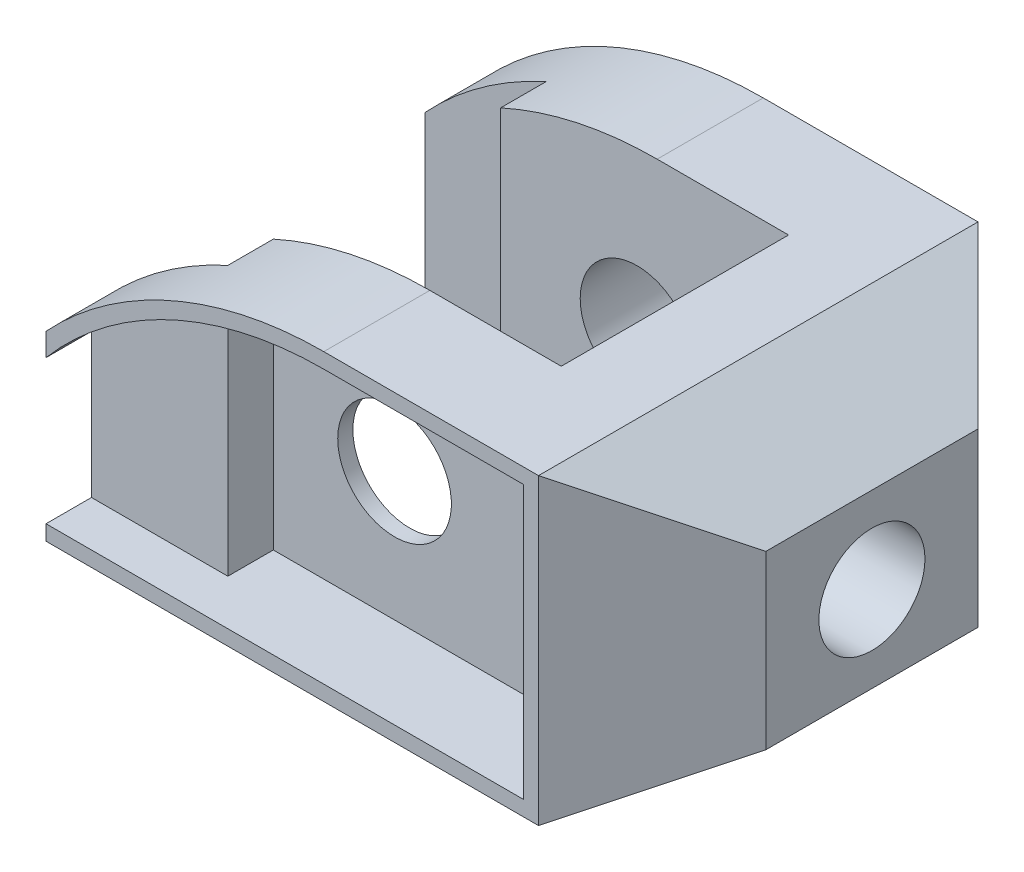
ISO-10303-21;
HEADER;
FILE_DESCRIPTION(('STEP AP214'),'2;1');
FILE_NAME('part.step','',(''),(''),'','','');
FILE_SCHEMA(('AUTOMOTIVE_DESIGN { 1 0 10303 214 1 1 1 1 }'));
ENDSEC;
DATA;
#1=APPLICATION_CONTEXT('core data for automotive mechanical design processes');
#2=APPLICATION_PROTOCOL_DEFINITION('international standard','automotive_design',2000,#1);
#3=PRODUCT_CONTEXT('',#1,'mechanical');
#4=PRODUCT('Part','Part','',(#3));
#5=PRODUCT_RELATED_PRODUCT_CATEGORY('part','',(#4));
#6=PRODUCT_DEFINITION_FORMATION('','',#4);
#7=PRODUCT_DEFINITION_CONTEXT('part definition',#1,'design');
#8=PRODUCT_DEFINITION('design','',#6,#7);
#9=PRODUCT_DEFINITION_SHAPE('','',#8);
#10=(LENGTH_UNIT() NAMED_UNIT(*) SI_UNIT(.MILLI.,.METRE.));
#11=(NAMED_UNIT(*) PLANE_ANGLE_UNIT() SI_UNIT($,.RADIAN.));
#12=(NAMED_UNIT(*) SI_UNIT($,.STERADIAN.) SOLID_ANGLE_UNIT());
#13=UNCERTAINTY_MEASURE_WITH_UNIT(LENGTH_MEASURE(1.E-05),#10,'distance_accuracy_value','');
#14=(GEOMETRIC_REPRESENTATION_CONTEXT(3) GLOBAL_UNCERTAINTY_ASSIGNED_CONTEXT((#13)) GLOBAL_UNIT_ASSIGNED_CONTEXT((#10,
#11,#12)) REPRESENTATION_CONTEXT('',''));
#15=CARTESIAN_POINT('',(0.,0.,0.));
#16=DIRECTION('',(0.,0.,1.));
#17=DIRECTION('',(1.,0.,0.));
#18=AXIS2_PLACEMENT_3D('',#15,#16,#17);
#19=CARTESIAN_POINT('',(65.,0.,58.));
#20=DIRECTION('',(0.,1.,0.));
#21=DIRECTION('',(-1.,0.,0.));
#22=AXIS2_PLACEMENT_3D('',#19,#20,#21);
#23=PLANE('',#22);
#24=DIRECTION('',(-1.,0.,0.));
#25=VECTOR('',#24,1.);
#26=CARTESIAN_POINT('',(16.,0.,8.));
#27=LINE('',#26,#25);
#28=CARTESIAN_POINT('',(16.,0.,8.));
#29=VERTEX_POINT('',#28);
#30=CARTESIAN_POINT('',(0.,0.,8.));
#31=VERTEX_POINT('',#30);
#32=EDGE_CURVE('E266',#29,#31,#27,.T.);
#33=ORIENTED_EDGE('',*,*,#32,.T.);
#34=DIRECTION('',(0.,0.,-1.));
#35=VECTOR('',#34,1.);
#36=CARTESIAN_POINT('',(0.,0.,58.));
#37=LINE('',#36,#35);
#38=CARTESIAN_POINT('',(0.,0.,0.));
#39=VERTEX_POINT('',#38);
#40=EDGE_CURVE('E356',#31,#39,#37,.T.);
#41=ORIENTED_EDGE('',*,*,#40,.T.);
#42=DIRECTION('',(1.,0.,0.));
#43=VECTOR('',#42,1.);
#44=CARTESIAN_POINT('',(65.,0.,0.));
#45=LINE('',#44,#43);
#46=CARTESIAN_POINT('',(65.,0.,0.));
#47=VERTEX_POINT('',#46);
#48=EDGE_CURVE('E339',#39,#47,#45,.T.);
#49=ORIENTED_EDGE('',*,*,#48,.T.);
#50=DIRECTION('',(0.,0.,-1.));
#51=VECTOR('',#50,1.);
#52=CARTESIAN_POINT('',(65.,0.,58.));
#53=LINE('',#52,#51);
#54=CARTESIAN_POINT('',(65.,0.,58.));
#55=VERTEX_POINT('',#54);
#56=EDGE_CURVE('E397',#55,#47,#53,.T.);
#57=ORIENTED_EDGE('',*,*,#56,.F.);
#58=DIRECTION('',(1.,0.,0.));
#59=VECTOR('',#58,1.);
#60=CARTESIAN_POINT('',(65.,0.,58.));
#61=LINE('',#60,#59);
#62=CARTESIAN_POINT('',(0.,0.,58.));
#63=VERTEX_POINT('',#62);
#64=EDGE_CURVE('E340',#63,#55,#61,.T.);
#65=ORIENTED_EDGE('',*,*,#64,.F.);
#66=CARTESIAN_POINT('',(0.,0.,50.));
#67=VERTEX_POINT('',#66);
#68=EDGE_CURVE('E371',#63,#67,#37,.T.);
#69=ORIENTED_EDGE('',*,*,#68,.T.);
#70=DIRECTION('',(1.,0.,0.));
#71=VECTOR('',#70,1.);
#72=CARTESIAN_POINT('',(0.,0.,50.));
#73=LINE('',#72,#71);
#74=CARTESIAN_POINT('',(16.,0.,50.));
#75=VERTEX_POINT('',#74);
#76=EDGE_CURVE('E281',#67,#75,#73,.T.);
#77=ORIENTED_EDGE('',*,*,#76,.T.);
#78=DIRECTION('',(0.,0.,-1.));
#79=VECTOR('',#78,1.);
#80=CARTESIAN_POINT('',(16.,0.,50.));
#81=LINE('',#80,#79);
#82=CARTESIAN_POINT('',(16.,0.,44.));
#83=VERTEX_POINT('',#82);
#84=EDGE_CURVE('E285',#75,#83,#81,.T.);
#85=ORIENTED_EDGE('',*,*,#84,.T.);
#86=DIRECTION('',(1.,0.,0.));
#87=VECTOR('',#86,1.);
#88=CARTESIAN_POINT('',(16.,0.,44.));
#89=LINE('',#88,#87);
#90=CARTESIAN_POINT('',(54.,0.,44.));
#91=VERTEX_POINT('',#90);
#92=EDGE_CURVE('E289',#83,#91,#89,.T.);
#93=ORIENTED_EDGE('',*,*,#92,.T.);
#94=DIRECTION('',(0.,0.,-1.));
#95=VECTOR('',#94,1.);
#96=CARTESIAN_POINT('',(54.,0.,44.));
#97=LINE('',#96,#95);
#98=CARTESIAN_POINT('',(54.,0.,14.));
#99=VERTEX_POINT('',#98);
#100=EDGE_CURVE('E293',#91,#99,#97,.T.);
#101=ORIENTED_EDGE('',*,*,#100,.T.);
#102=DIRECTION('',(-1.,0.,0.));
#103=VECTOR('',#102,1.);
#104=CARTESIAN_POINT('',(54.,0.,14.));
#105=LINE('',#104,#103);
#106=CARTESIAN_POINT('',(16.,0.,14.));
#107=VERTEX_POINT('',#106);
#108=EDGE_CURVE('E297',#99,#107,#105,.T.);
#109=ORIENTED_EDGE('',*,*,#108,.T.);
#110=DIRECTION('',(0.,0.,-1.));
#111=VECTOR('',#110,1.);
#112=CARTESIAN_POINT('',(16.,0.,14.));
#113=LINE('',#112,#111);
#114=EDGE_CURVE('E271',#107,#29,#113,.T.);
#115=ORIENTED_EDGE('',*,*,#114,.T.);
#116=EDGE_LOOP('',(#33,#41,#49,#57,#65,#69,#77,#85,#93,#101,#109,#115));
#117=FACE_BOUND('',#116,.T.);
#118=ADVANCED_FACE('F48',(#117),#23,.F.);
#119=CARTESIAN_POINT('',(36.6606055596467,40.,58.));
#120=DIRECTION('',(0.,-1.,0.));
#121=DIRECTION('',(1.,0.,0.));
#122=AXIS2_PLACEMENT_3D('',#119,#120,#121);
#123=PLANE('',#122);
#124=DIRECTION('',(1.,0.,0.));
#125=VECTOR('',#124,1.);
#126=CARTESIAN_POINT('',(16.,40.,44.));
#127=LINE('',#126,#125);
#128=CARTESIAN_POINT('',(36.6606055596467,40.,44.));
#129=VERTEX_POINT('',#128);
#130=CARTESIAN_POINT('',(54.,40.,44.));
#131=VERTEX_POINT('',#130);
#132=EDGE_CURVE('E267',#129,#131,#127,.T.);
#133=ORIENTED_EDGE('',*,*,#132,.F.);
#134=DIRECTION('',(0.,0.,-1.));
#135=VECTOR('',#134,1.);
#136=CARTESIAN_POINT('',(36.6606055596467,40.,58.));
#137=LINE('',#136,#135);
#138=CARTESIAN_POINT('',(36.6606055596467,40.,58.));
#139=VERTEX_POINT('',#138);
#140=EDGE_CURVE('E381',#139,#129,#137,.T.);
#141=ORIENTED_EDGE('',*,*,#140,.F.);
#142=DIRECTION('',(-1.,0.,0.));
#143=VECTOR('',#142,1.);
#144=CARTESIAN_POINT('',(36.6606055596467,40.,58.));
#145=LINE('',#144,#143);
#146=CARTESIAN_POINT('',(65.,40.,58.));
#147=VERTEX_POINT('',#146);
#148=EDGE_CURVE('E344',#147,#139,#145,.T.);
#149=ORIENTED_EDGE('',*,*,#148,.F.);
#150=DIRECTION('',(0.,0.,-1.));
#151=VECTOR('',#150,1.);
#152=CARTESIAN_POINT('',(65.,40.,58.));
#153=LINE('',#152,#151);
#154=CARTESIAN_POINT('',(65.,40.,0.));
#155=VERTEX_POINT('',#154);
#156=EDGE_CURVE('E385',#147,#155,#153,.T.);
#157=ORIENTED_EDGE('',*,*,#156,.T.);
#158=DIRECTION('',(-1.,0.,0.));
#159=VECTOR('',#158,1.);
#160=CARTESIAN_POINT('',(36.6606055596467,40.,0.));
#161=LINE('',#160,#159);
#162=CARTESIAN_POINT('',(36.6606055596467,40.,0.));
#163=VERTEX_POINT('',#162);
#164=EDGE_CURVE('E360',#155,#163,#161,.T.);
#165=ORIENTED_EDGE('',*,*,#164,.T.);
#166=CARTESIAN_POINT('',(36.6606055596467,40.,14.));
#167=VERTEX_POINT('',#166);
#168=EDGE_CURVE('E380',#167,#163,#137,.T.);
#169=ORIENTED_EDGE('',*,*,#168,.F.);
#170=DIRECTION('',(-1.,0.,0.));
#171=VECTOR('',#170,1.);
#172=CARTESIAN_POINT('',(54.,40.,14.));
#173=LINE('',#172,#171);
#174=CARTESIAN_POINT('',(54.,40.,14.));
#175=VERTEX_POINT('',#174);
#176=EDGE_CURVE('E274',#175,#167,#173,.T.);
#177=ORIENTED_EDGE('',*,*,#176,.F.);
#178=DIRECTION('',(0.,0.,-1.));
#179=VECTOR('',#178,1.);
#180=CARTESIAN_POINT('',(54.,40.,44.));
#181=LINE('',#180,#179);
#182=EDGE_CURVE('E270',#131,#175,#181,.T.);
#183=ORIENTED_EDGE('',*,*,#182,.F.);
#184=EDGE_LOOP('',(#133,#141,#149,#157,#165,#169,#177,#183));
#185=FACE_BOUND('',#184,.T.);
#186=ADVANCED_FACE('F448',(#185),#123,.F.);
#187=CARTESIAN_POINT('',(36.6606055596467,-9.99999999999999,58.));
#188=DIRECTION('',(0.,0.,-1.));
#189=DIRECTION('',(-1.,0.,0.));
#190=AXIS2_PLACEMENT_3D('',#187,#188,#189);
#191=CYLINDRICAL_SURFACE('',#190,50.);
#192=CARTESIAN_POINT('',(36.6606055596467,-9.99999999999999,50.));
#193=DIRECTION('',(0.,0.,-1.));
#194=DIRECTION('',(-1.,0.,0.));
#195=AXIS2_PLACEMENT_3D('',#192,#193,#194);
#196=CIRCLE('',#195,50.);
#197=CARTESIAN_POINT('',(0.,24.,50.));
#198=VERTEX_POINT('',#197);
#199=CARTESIAN_POINT('',(16.,35.5317403347236,50.));
#200=VERTEX_POINT('',#199);
#201=EDGE_CURVE('E329',#198,#200,#196,.T.);
#202=ORIENTED_EDGE('',*,*,#201,.F.);
#203=DIRECTION('',(0.,0.,-1.));
#204=VECTOR('',#203,1.);
#205=CARTESIAN_POINT('',(0.,24.,58.));
#206=LINE('',#205,#204);
#207=CARTESIAN_POINT('',(0.,24.,58.));
#208=VERTEX_POINT('',#207);
#209=EDGE_CURVE('E376',#208,#198,#206,.T.);
#210=ORIENTED_EDGE('',*,*,#209,.F.);
#211=CARTESIAN_POINT('',(36.6606055596467,-9.99999999999999,58.));
#212=DIRECTION('',(0.,0.,1.));
#213=DIRECTION('',(-1.,0.,0.));
#214=AXIS2_PLACEMENT_3D('',#211,#212,#213);
#215=CIRCLE('',#214,50.);
#216=EDGE_CURVE('E348',#139,#208,#215,.T.);
#217=ORIENTED_EDGE('',*,*,#216,.F.);
#218=ORIENTED_EDGE('',*,*,#140,.T.);
#219=CARTESIAN_POINT('',(36.6606055596467,-9.99999999999999,44.));
#220=DIRECTION('',(0.,0.,-1.));
#221=DIRECTION('',(-1.,0.,0.));
#222=AXIS2_PLACEMENT_3D('',#219,#220,#221);
#223=CIRCLE('',#222,50.);
#224=CARTESIAN_POINT('',(16.,35.5317403347236,44.));
#225=VERTEX_POINT('',#224);
#226=EDGE_CURVE('E326',#225,#129,#223,.T.);
#227=ORIENTED_EDGE('',*,*,#226,.F.);
#228=DIRECTION('',(0.,0.,-1.));
#229=VECTOR('',#228,1.);
#230=CARTESIAN_POINT('',(16.,35.5317403347236,58.));
#231=LINE('',#230,#229);
#232=EDGE_CURVE('E416',#200,#225,#231,.T.);
#233=ORIENTED_EDGE('',*,*,#232,.F.);
#234=EDGE_LOOP('',(#202,#210,#217,#218,#227,#233));
#235=FACE_BOUND('',#234,.T.);
#236=ADVANCED_FACE('F454',(#235),#191,.T.);
#237=CARTESIAN_POINT('',(36.6606055596467,-9.99999999999999,8.));
#238=DIRECTION('',(0.,0.,1.));
#239=DIRECTION('',(1.,0.,0.));
#240=AXIS2_PLACEMENT_3D('',#237,#238,#239);
#241=CIRCLE('',#240,50.);
#242=CARTESIAN_POINT('',(16.,35.5317403347236,8.));
#243=VERTEX_POINT('',#242);
#244=CARTESIAN_POINT('',(0.,24.,8.));
#245=VERTEX_POINT('',#244);
#246=EDGE_CURVE('E332',#243,#245,#241,.T.);
#247=ORIENTED_EDGE('',*,*,#246,.F.);
#248=DIRECTION('',(0.,0.,-1.));
#249=VECTOR('',#248,1.);
#250=CARTESIAN_POINT('',(16.,35.5317403347236,58.));
#251=LINE('',#250,#249);
#252=CARTESIAN_POINT('',(16.,35.5317403347236,14.));
#253=VERTEX_POINT('',#252);
#254=EDGE_CURVE('E413',#253,#243,#251,.T.);
#255=ORIENTED_EDGE('',*,*,#254,.F.);
#256=CARTESIAN_POINT('',(36.6606055596467,-9.99999999999999,14.));
#257=DIRECTION('',(0.,0.,1.));
#258=DIRECTION('',(1.,0.,0.));
#259=AXIS2_PLACEMENT_3D('',#256,#257,#258);
#260=CIRCLE('',#259,50.);
#261=EDGE_CURVE('E322',#167,#253,#260,.T.);
#262=ORIENTED_EDGE('',*,*,#261,.F.);
#263=ORIENTED_EDGE('',*,*,#168,.T.);
#264=CARTESIAN_POINT('',(36.6606055596467,-9.99999999999999,0.));
#265=DIRECTION('',(0.,0.,1.));
#266=DIRECTION('',(-1.,0.,0.));
#267=AXIS2_PLACEMENT_3D('',#264,#265,#266);
#268=CIRCLE('',#267,50.);
#269=CARTESIAN_POINT('',(0.,24.,0.));
#270=VERTEX_POINT('',#269);
#271=EDGE_CURVE('E364',#163,#270,#268,.T.);
#272=ORIENTED_EDGE('',*,*,#271,.T.);
#273=EDGE_CURVE('E375',#245,#270,#206,.T.);
#274=ORIENTED_EDGE('',*,*,#273,.F.);
#275=EDGE_LOOP('',(#247,#255,#262,#263,#272,#274));
#276=FACE_BOUND('',#275,.T.);
#277=ADVANCED_FACE('F475',(#276),#191,.T.);
#278=CARTESIAN_POINT('',(0.,0.,58.));
#279=DIRECTION('',(1.,0.,0.));
#280=DIRECTION('',(0.,0.,-1.));
#281=AXIS2_PLACEMENT_3D('',#278,#279,#280);
#282=PLANE('',#281);
#283=DIRECTION('',(0.,-1.,0.));
#284=VECTOR('',#283,1.);
#285=CARTESIAN_POINT('',(0.,0.,8.));
#286=LINE('',#285,#284);
#287=EDGE_CURVE('E410',#245,#31,#286,.T.);
#288=ORIENTED_EDGE('',*,*,#287,.F.);
#289=ORIENTED_EDGE('',*,*,#273,.T.);
#290=DIRECTION('',(0.,-1.,0.));
#291=VECTOR('',#290,1.);
#292=CARTESIAN_POINT('',(0.,0.,0.));
#293=LINE('',#292,#291);
#294=EDGE_CURVE('E345',#270,#39,#293,.T.);
#295=ORIENTED_EDGE('',*,*,#294,.T.);
#296=ORIENTED_EDGE('',*,*,#40,.F.);
#297=EDGE_LOOP('',(#288,#289,#295,#296));
#298=FACE_BOUND('',#297,.T.);
#299=ADVANCED_FACE('F538',(#298),#282,.F.);
#300=DIRECTION('',(0.,-1.,0.));
#301=VECTOR('',#300,1.);
#302=CARTESIAN_POINT('',(0.,0.,58.));
#303=LINE('',#302,#301);
#304=CARTESIAN_POINT('',(0.,2.,58.));
#305=VERTEX_POINT('',#304);
#306=EDGE_CURVE('E351',#305,#63,#303,.T.);
#307=ORIENTED_EDGE('',*,*,#306,.F.);
#308=DIRECTION('',(0.,0.,-1.));
#309=VECTOR('',#308,1.);
#310=CARTESIAN_POINT('',(0.,2.,58.));
#311=LINE('',#310,#309);
#312=CARTESIAN_POINT('',(0.,2.,52.));
#313=VERTEX_POINT('',#312);
#314=EDGE_CURVE('E632',#305,#313,#311,.T.);
#315=ORIENTED_EDGE('',*,*,#314,.T.);
#316=DIRECTION('',(0.,1.,0.));
#317=VECTOR('',#316,1.);
#318=CARTESIAN_POINT('',(0.,0.,52.));
#319=LINE('',#318,#317);
#320=CARTESIAN_POINT('',(0.,20.9838667696594,52.));
#321=VERTEX_POINT('',#320);
#322=EDGE_CURVE('E207',#313,#321,#319,.T.);
#323=ORIENTED_EDGE('',*,*,#322,.T.);
#324=DIRECTION('',(0.,0.,1.));
#325=VECTOR('',#324,1.);
#326=CARTESIAN_POINT('',(0.,20.9838667696594,10.6034513424069));
#327=LINE('',#326,#325);
#328=CARTESIAN_POINT('',(0.,20.9838667696593,58.));
#329=VERTEX_POINT('',#328);
#330=EDGE_CURVE('E635',#321,#329,#327,.T.);
#331=ORIENTED_EDGE('',*,*,#330,.T.);
#332=EDGE_CURVE('E352',#208,#329,#303,.T.);
#333=ORIENTED_EDGE('',*,*,#332,.F.);
#334=ORIENTED_EDGE('',*,*,#209,.T.);
#335=DIRECTION('',(0.,1.,0.));
#336=VECTOR('',#335,1.);
#337=CARTESIAN_POINT('',(0.,0.,50.));
#338=LINE('',#337,#336);
#339=EDGE_CURVE('E401',#67,#198,#338,.T.);
#340=ORIENTED_EDGE('',*,*,#339,.F.);
#341=ORIENTED_EDGE('',*,*,#68,.F.);
#342=EDGE_LOOP('',(#307,#315,#323,#331,#333,#334,#340,#341));
#343=FACE_BOUND('',#342,.T.);
#344=ADVANCED_FACE('F491',(#343),#282,.F.);
#345=CARTESIAN_POINT('',(34.,19.,58.));
#346=DIRECTION('',(0.,0.,-1.));
#347=DIRECTION('',(-1.,0.,0.));
#348=AXIS2_PLACEMENT_3D('',#345,#346,#347);
#349=CYLINDRICAL_SURFACE('',#348,7.5);
#350=CARTESIAN_POINT('',(34.,19.,46.));
#351=DIRECTION('',(0.,0.,-1.));
#352=DIRECTION('',(-1.,0.,0.));
#353=AXIS2_PLACEMENT_3D('',#350,#351,#352);
#354=CIRCLE('',#353,7.5);
#355=CARTESIAN_POINT('',(26.5,19.,46.));
#356=VERTEX_POINT('',#355);
#357=EDGE_CURVE('E51',#356,#356,#354,.T.);
#358=CARTESIAN_POINT('',(34.,19.,44.));
#359=DIRECTION('',(0.,0.,-1.));
#360=DIRECTION('',(-1.,0.,0.));
#361=AXIS2_PLACEMENT_3D('',#358,#359,#360);
#362=CIRCLE('',#361,7.5);
#363=CARTESIAN_POINT('',(26.5,19.,44.));
#364=VERTEX_POINT('',#363);
#365=EDGE_CURVE('E325',#364,#364,#362,.T.);
#366=CARTESIAN_POINT('',(26.5,19.,46.));
#367=CARTESIAN_POINT('',(26.5,19.,45.9791666666667));
#368=CARTESIAN_POINT('',(26.5,19.,45.9583333333333));
#369=CARTESIAN_POINT('',(26.5,19.,45.9166666666667));
#370=CARTESIAN_POINT('',(26.5,19.,45.8958333333333));
#371=CARTESIAN_POINT('',(26.5,19.,45.8541666666667));
#372=CARTESIAN_POINT('',(26.5,19.,45.8333333333333));
#373=CARTESIAN_POINT('',(26.5,19.,45.7916666666667));
#374=CARTESIAN_POINT('',(26.5,19.,45.7708333333333));
#375=CARTESIAN_POINT('',(26.5,19.,45.7291666666667));
#376=CARTESIAN_POINT('',(26.5,19.,45.7083333333333));
#377=CARTESIAN_POINT('',(26.5,19.,45.6666666666667));
#378=CARTESIAN_POINT('',(26.5,19.,45.6458333333333));
#379=CARTESIAN_POINT('',(26.5,19.,45.6041666666667));
#380=CARTESIAN_POINT('',(26.5,19.,45.5833333333333));
#381=CARTESIAN_POINT('',(26.5,19.,45.5416666666667));
#382=CARTESIAN_POINT('',(26.5,19.,45.5208333333333));
#383=CARTESIAN_POINT('',(26.5,19.,45.4791666666667));
#384=CARTESIAN_POINT('',(26.5,19.,45.4583333333333));
#385=CARTESIAN_POINT('',(26.5,19.,45.4166666666667));
#386=CARTESIAN_POINT('',(26.5,19.,45.3958333333333));
#387=CARTESIAN_POINT('',(26.5,19.,45.3541666666667));
#388=CARTESIAN_POINT('',(26.5,19.,45.3333333333333));
#389=CARTESIAN_POINT('',(26.5,19.,45.2916666666667));
#390=CARTESIAN_POINT('',(26.5,19.,45.2708333333333));
#391=CARTESIAN_POINT('',(26.5,19.,45.2291666666667));
#392=CARTESIAN_POINT('',(26.5,19.,45.2083333333333));
#393=CARTESIAN_POINT('',(26.5,19.,45.1666666666667));
#394=CARTESIAN_POINT('',(26.5,19.,45.1458333333333));
#395=CARTESIAN_POINT('',(26.5,19.,45.1041666666667));
#396=CARTESIAN_POINT('',(26.5,19.,45.0833333333333));
#397=CARTESIAN_POINT('',(26.5,19.,45.0416666666667));
#398=CARTESIAN_POINT('',(26.5,19.,45.0208333333333));
#399=CARTESIAN_POINT('',(26.5,19.,44.9791666666667));
#400=CARTESIAN_POINT('',(26.5,19.,44.9583333333333));
#401=CARTESIAN_POINT('',(26.5,19.,44.9166666666667));
#402=CARTESIAN_POINT('',(26.5,19.,44.8958333333333));
#403=CARTESIAN_POINT('',(26.5,19.,44.8541666666667));
#404=CARTESIAN_POINT('',(26.5,19.,44.8333333333333));
#405=CARTESIAN_POINT('',(26.5,19.,44.7916666666667));
#406=CARTESIAN_POINT('',(26.5,19.,44.7708333333333));
#407=CARTESIAN_POINT('',(26.5,19.,44.7291666666667));
#408=CARTESIAN_POINT('',(26.5,19.,44.7083333333333));
#409=CARTESIAN_POINT('',(26.5,19.,44.6666666666667));
#410=CARTESIAN_POINT('',(26.5,19.,44.6458333333333));
#411=CARTESIAN_POINT('',(26.5,19.,44.6041666666667));
#412=CARTESIAN_POINT('',(26.5,19.,44.5833333333333));
#413=CARTESIAN_POINT('',(26.5,19.,44.5416666666667));
#414=CARTESIAN_POINT('',(26.5,19.,44.5208333333333));
#415=CARTESIAN_POINT('',(26.5,19.,44.4791666666667));
#416=CARTESIAN_POINT('',(26.5,19.,44.4583333333333));
#417=CARTESIAN_POINT('',(26.5,19.,44.4166666666667));
#418=CARTESIAN_POINT('',(26.5,19.,44.3958333333333));
#419=CARTESIAN_POINT('',(26.5,19.,44.3541666666667));
#420=CARTESIAN_POINT('',(26.5,19.,44.3333333333333));
#421=CARTESIAN_POINT('',(26.5,19.,44.2916666666667));
#422=CARTESIAN_POINT('',(26.5,19.,44.2708333333333));
#423=CARTESIAN_POINT('',(26.5,19.,44.2291666666667));
#424=CARTESIAN_POINT('',(26.5,19.,44.2083333333333));
#425=CARTESIAN_POINT('',(26.5,19.,44.1666666666667));
#426=CARTESIAN_POINT('',(26.5,19.,44.1458333333333));
#427=CARTESIAN_POINT('',(26.5,19.,44.1041666666667));
#428=CARTESIAN_POINT('',(26.5,19.,44.0833333333333));
#429=CARTESIAN_POINT('',(26.5,19.,44.0416666666667));
#430=CARTESIAN_POINT('',(26.5,19.,44.0208333333333));
#431=CARTESIAN_POINT('',(26.5,19.,44.));
#432=B_SPLINE_CURVE_WITH_KNOTS('',3,(#366,#367,#368,#369,#370,#371,#372,#373,#374,#375,#376,
#377,#378,#379,#380,#381,#382,#383,#384,#385,#386,#387,#388,#389,#390,#391,#392,#393,#394,#395,
#396,#397,#398,#399,#400,#401,#402,#403,#404,#405,#406,#407,#408,#409,#410,#411,#412,#413,#414,
#415,#416,#417,#418,#419,#420,#421,#422,#423,#424,#425,#426,#427,#428,#429,#430,#431),
.UNSPECIFIED.,.F.,.F.,(4,2,2,2,2,2,2,2,2,2,2,2,2,2,2,2,2,2,2,2,2,2,2,2,2,2,2,2,2,2,2,2,4),(0.,
0.0625000000000001,0.125,0.1875,0.25,0.3125,0.375,0.4375,0.5,0.5625,0.625000000000001,
0.687500000000001,0.750000000000001,0.812500000000001,0.875000000000001,0.937500000000001,1.,
1.0625,1.125,1.1875,1.25,1.3125,1.375,1.4375,1.5,1.5625,1.625,1.6875,1.75,1.8125,1.875,1.9375,
2.),.UNSPECIFIED.);
#433=EDGE_CURVE('BSEAM546',#356,#364,#432,.T.);
#434=ORIENTED_EDGE('',*,*,#357,.F.);
#435=ORIENTED_EDGE('',*,*,#365,.T.);
#436=ORIENTED_EDGE('',*,*,#433,.T.);
#437=ORIENTED_EDGE('',*,*,#433,.F.);
#438=EDGE_LOOP('',(#434,#436,#435,#437));
#439=FACE_BOUND('',#438,.T.);
#440=ADVANCED_FACE('F546',(#439),#349,.F.);
#441=CARTESIAN_POINT('',(34.,19.,0.));
#442=DIRECTION('',(0.,0.,1.));
#443=DIRECTION('',(1.,0.,0.));
#444=AXIS2_PLACEMENT_3D('',#441,#442,#443);
#445=CIRCLE('',#444,7.5);
#446=CARTESIAN_POINT('',(26.5,19.,0.));
#447=VERTEX_POINT('',#446);
#448=EDGE_CURVE('E335',#447,#447,#445,.T.);
#449=CARTESIAN_POINT('',(34.,19.,14.));
#450=DIRECTION('',(0.,0.,1.));
#451=DIRECTION('',(1.,0.,0.));
#452=AXIS2_PLACEMENT_3D('',#449,#450,#451);
#453=CIRCLE('',#452,7.5);
#454=CARTESIAN_POINT('',(26.5,19.,14.));
#455=VERTEX_POINT('',#454);
#456=EDGE_CURVE('E321',#455,#455,#453,.T.);
#457=CARTESIAN_POINT('',(26.5,19.,0.));
#458=CARTESIAN_POINT('',(26.5,19.,0.145833333333333));
#459=CARTESIAN_POINT('',(26.5,19.,0.291666666666667));
#460=CARTESIAN_POINT('',(26.5,19.,0.583333333333334));
#461=CARTESIAN_POINT('',(26.5,19.,0.729166666666667));
#462=CARTESIAN_POINT('',(26.5,19.,1.02083333333333));
#463=CARTESIAN_POINT('',(26.5,19.,1.16666666666667));
#464=CARTESIAN_POINT('',(26.5,19.,1.45833333333333));
#465=CARTESIAN_POINT('',(26.5,19.,1.60416666666667));
#466=CARTESIAN_POINT('',(26.5,19.,1.89583333333334));
#467=CARTESIAN_POINT('',(26.5,19.,2.04166666666667));
#468=CARTESIAN_POINT('',(26.5,19.,2.33333333333334));
#469=CARTESIAN_POINT('',(26.5,19.,2.47916666666667));
#470=CARTESIAN_POINT('',(26.5,19.,2.77083333333334));
#471=CARTESIAN_POINT('',(26.5,19.,2.91666666666667));
#472=CARTESIAN_POINT('',(26.5,19.,3.20833333333334));
#473=CARTESIAN_POINT('',(26.5,19.,3.35416666666667));
#474=CARTESIAN_POINT('',(26.5,19.,3.64583333333333));
#475=CARTESIAN_POINT('',(26.5,19.,3.79166666666667));
#476=CARTESIAN_POINT('',(26.5,19.,4.08333333333333));
#477=CARTESIAN_POINT('',(26.5,19.,4.22916666666666));
#478=CARTESIAN_POINT('',(26.5,19.,4.52083333333333));
#479=CARTESIAN_POINT('',(26.5,19.,4.66666666666666));
#480=CARTESIAN_POINT('',(26.5,19.,4.95833333333333));
#481=CARTESIAN_POINT('',(26.5,19.,5.10416666666666));
#482=CARTESIAN_POINT('',(26.5,19.,5.39583333333333));
#483=CARTESIAN_POINT('',(26.5,19.,5.54166666666666));
#484=CARTESIAN_POINT('',(26.5,19.,5.83333333333333));
#485=CARTESIAN_POINT('',(26.5,19.,5.97916666666667));
#486=CARTESIAN_POINT('',(26.5,19.,6.27083333333333));
#487=CARTESIAN_POINT('',(26.5,19.,6.41666666666667));
#488=CARTESIAN_POINT('',(26.5,19.,6.70833333333333));
#489=CARTESIAN_POINT('',(26.5,19.,6.85416666666667));
#490=CARTESIAN_POINT('',(26.5,19.,7.14583333333333));
#491=CARTESIAN_POINT('',(26.5,19.,7.29166666666667));
#492=CARTESIAN_POINT('',(26.5,19.,7.58333333333333));
#493=CARTESIAN_POINT('',(26.5,19.,7.72916666666667));
#494=CARTESIAN_POINT('',(26.5,19.,8.02083333333333));
#495=CARTESIAN_POINT('',(26.5,19.,8.16666666666667));
#496=CARTESIAN_POINT('',(26.5,19.,8.45833333333333));
#497=CARTESIAN_POINT('',(26.5,19.,8.60416666666667));
#498=CARTESIAN_POINT('',(26.5,19.,8.89583333333333));
#499=CARTESIAN_POINT('',(26.5,19.,9.04166666666667));
#500=CARTESIAN_POINT('',(26.5,19.,9.33333333333333));
#501=CARTESIAN_POINT('',(26.5,19.,9.47916666666666));
#502=CARTESIAN_POINT('',(26.5,19.,9.77083333333333));
#503=CARTESIAN_POINT('',(26.5,19.,9.91666666666667));
#504=CARTESIAN_POINT('',(26.5,19.,10.2083333333333));
#505=CARTESIAN_POINT('',(26.5,19.,10.3541666666667));
#506=CARTESIAN_POINT('',(26.5,19.,10.6458333333333));
#507=CARTESIAN_POINT('',(26.5,19.,10.7916666666667));
#508=CARTESIAN_POINT('',(26.5,19.,11.0833333333333));
#509=CARTESIAN_POINT('',(26.5,19.,11.2291666666667));
#510=CARTESIAN_POINT('',(26.5,19.,11.5208333333333));
#511=CARTESIAN_POINT('',(26.5,19.,11.6666666666667));
#512=CARTESIAN_POINT('',(26.5,19.,11.9583333333333));
#513=CARTESIAN_POINT('',(26.5,19.,12.1041666666667));
#514=CARTESIAN_POINT('',(26.5,19.,12.3958333333333));
#515=CARTESIAN_POINT('',(26.5,19.,12.5416666666667));
#516=CARTESIAN_POINT('',(26.5,19.,12.8333333333333));
#517=CARTESIAN_POINT('',(26.5,19.,12.9791666666667));
#518=CARTESIAN_POINT('',(26.5,19.,13.2708333333333));
#519=CARTESIAN_POINT('',(26.5,19.,13.4166666666667));
#520=CARTESIAN_POINT('',(26.5,19.,13.7083333333333));
#521=CARTESIAN_POINT('',(26.5,19.,13.8541666666667));
#522=CARTESIAN_POINT('',(26.5,19.,14.));
#523=B_SPLINE_CURVE_WITH_KNOTS('',3,(#457,#458,#459,#460,#461,#462,#463,#464,#465,#466,#467,
#468,#469,#470,#471,#472,#473,#474,#475,#476,#477,#478,#479,#480,#481,#482,#483,#484,#485,#486,
#487,#488,#489,#490,#491,#492,#493,#494,#495,#496,#497,#498,#499,#500,#501,#502,#503,#504,#505,
#506,#507,#508,#509,#510,#511,#512,#513,#514,#515,#516,#517,#518,#519,#520,#521,#522),
.UNSPECIFIED.,.F.,.F.,(4,2,2,2,2,2,2,2,2,2,2,2,2,2,2,2,2,2,2,2,2,2,2,2,2,2,2,2,2,2,2,2,4),(0.,
0.4375,0.875000000000001,1.3125,1.75,2.1875,2.625,3.0625,3.5,3.9375,4.375,4.8125,5.25,5.6875,
6.125,6.5625,7.,7.4375,7.875,8.3125,8.75,9.1875,9.62499999999999,10.0625,10.5,10.9375,11.375,
11.8125,12.25,12.6875,13.125,13.5625,14.),.UNSPECIFIED.);
#524=EDGE_CURVE('BSEAM535',#447,#455,#523,.T.);
#525=ORIENTED_EDGE('',*,*,#448,.F.);
#526=ORIENTED_EDGE('',*,*,#456,.T.);
#527=ORIENTED_EDGE('',*,*,#524,.T.);
#528=ORIENTED_EDGE('',*,*,#524,.F.);
#529=EDGE_LOOP('',(#525,#527,#526,#528));
#530=FACE_BOUND('',#529,.T.);
#531=ADVANCED_FACE('F535',(#530),#349,.F.);
#532=CARTESIAN_POINT('',(36.6606055596467,-9.99999999999999,58.));
#533=DIRECTION('',(0.,0.,-1.));
#534=DIRECTION('',(-1.,0.,0.));
#535=AXIS2_PLACEMENT_3D('',#532,#533,#534);
#536=PLANE('',#535);
#537=DIRECTION('',(1.,0.,0.));
#538=VECTOR('',#537,1.);
#539=CARTESIAN_POINT('',(18.,1.99999999999999,58.));
#540=LINE('',#539,#538);
#541=CARTESIAN_POINT('',(63.,1.99999999999995,58.));
#542=VERTEX_POINT('',#541);
#543=EDGE_CURVE('E488',#305,#542,#540,.T.);
#544=ORIENTED_EDGE('',*,*,#543,.F.);
#545=ORIENTED_EDGE('',*,*,#306,.T.);
#546=ORIENTED_EDGE('',*,*,#64,.T.);
#547=DIRECTION('',(0.,1.,0.));
#548=VECTOR('',#547,1.);
#549=CARTESIAN_POINT('',(65.,0.,58.));
#550=LINE('',#549,#548);
#551=EDGE_CURVE('E253',#55,#147,#550,.T.);
#552=ORIENTED_EDGE('',*,*,#551,.T.);
#553=ORIENTED_EDGE('',*,*,#148,.T.);
#554=ORIENTED_EDGE('',*,*,#216,.T.);
#555=ORIENTED_EDGE('',*,*,#332,.T.);
#556=CARTESIAN_POINT('',(36.6606055596467,-9.99999999999999,58.));
#557=DIRECTION('',(0.,0.,1.));
#558=DIRECTION('',(1.,0.,0.));
#559=AXIS2_PLACEMENT_3D('',#556,#557,#558);
#560=CIRCLE('',#559,48.);
#561=CARTESIAN_POINT('',(36.6606055596467,38.,58.));
#562=VERTEX_POINT('',#561);
#563=EDGE_CURVE('E617',#562,#329,#560,.T.);
#564=ORIENTED_EDGE('',*,*,#563,.F.);
#565=DIRECTION('',(-1.,0.,0.));
#566=VECTOR('',#565,1.);
#567=CARTESIAN_POINT('',(63.,38.,58.));
#568=LINE('',#567,#566);
#569=CARTESIAN_POINT('',(63.,38.,58.));
#570=VERTEX_POINT('',#569);
#571=EDGE_CURVE('E620',#570,#562,#568,.T.);
#572=ORIENTED_EDGE('',*,*,#571,.F.);
#573=DIRECTION('',(0.,1.,0.));
#574=VECTOR('',#573,1.);
#575=CARTESIAN_POINT('',(63.,1.99999999999995,58.));
#576=LINE('',#575,#574);
#577=EDGE_CURVE('E625',#542,#570,#576,.T.);
#578=ORIENTED_EDGE('',*,*,#577,.F.);
#579=EDGE_LOOP('',(#544,#545,#546,#552,#553,#554,#555,#564,#572,#578));
#580=FACE_BOUND('',#579,.T.);
#581=ADVANCED_FACE('F459',(#580),#536,.F.);
#582=CARTESIAN_POINT('',(36.6606055596467,-9.99999999999999,0.));
#583=DIRECTION('',(0.,0.,-1.));
#584=DIRECTION('',(-1.,0.,0.));
#585=AXIS2_PLACEMENT_3D('',#582,#583,#584);
#586=PLANE('',#585);
#587=DIRECTION('',(0.,1.,0.));
#588=VECTOR('',#587,1.);
#589=CARTESIAN_POINT('',(65.,0.,0.));
#590=LINE('',#589,#588);
#591=EDGE_CURVE('E245',#47,#155,#590,.T.);
#592=ORIENTED_EDGE('',*,*,#591,.F.);
#593=ORIENTED_EDGE('',*,*,#48,.F.);
#594=ORIENTED_EDGE('',*,*,#294,.F.);
#595=ORIENTED_EDGE('',*,*,#271,.F.);
#596=ORIENTED_EDGE('',*,*,#164,.F.);
#597=EDGE_LOOP('',(#592,#593,#594,#595,#596));
#598=FACE_BOUND('',#597,.T.);
#599=ORIENTED_EDGE('',*,*,#448,.T.);
#600=EDGE_LOOP('',(#599));
#601=FACE_BOUND('',#600,.T.);
#602=ADVANCED_FACE('F468',(#598,#601),#586,.T.);
#603=CARTESIAN_POINT('',(80.,8.66025403784442,58.));
#604=DIRECTION('',(-0.500000000000002,0.866025403784437,0.));
#605=DIRECTION('',(-0.866025403784437,-0.500000000000002,0.));
#606=AXIS2_PLACEMENT_3D('',#603,#604,#605);
#607=PLANE('',#606);
#608=ORIENTED_EDGE('',*,*,#56,.T.);
#609=DIRECTION('',(0.65465367070798,0.377964473009231,0.654653670707973));
#610=VECTOR('',#609,1.);
#611=CARTESIAN_POINT('',(98.4285714285714,19.2999947129104,33.4285714285711));
#612=LINE('',#611,#610);
#613=CARTESIAN_POINT('',(80.,8.66025403784442,14.9999999999998));
#614=VERTEX_POINT('',#613);
#615=EDGE_CURVE('E262',#47,#614,#612,.T.);
#616=ORIENTED_EDGE('',*,*,#615,.T.);
#617=DIRECTION('',(0.,0.,-1.));
#618=VECTOR('',#617,1.);
#619=CARTESIAN_POINT('',(80.,8.66025403784442,58.));
#620=LINE('',#619,#618);
#621=CARTESIAN_POINT('',(80.,8.66025403784442,43.0000000000002));
#622=VERTEX_POINT('',#621);
#623=EDGE_CURVE('E393',#622,#614,#620,.T.);
#624=ORIENTED_EDGE('',*,*,#623,.F.);
#625=DIRECTION('',(-0.65465367070798,-0.377964473009231,0.654653670707972));
#626=VECTOR('',#625,1.);
#627=CARTESIAN_POINT('',(73.5714285714287,4.948716593054,49.4285714285714));
#628=LINE('',#627,#626);
#629=EDGE_CURVE('E248',#622,#55,#628,.T.);
#630=ORIENTED_EDGE('',*,*,#629,.T.);
#631=EDGE_LOOP('',(#608,#616,#624,#630));
#632=FACE_BOUND('',#631,.T.);
#633=ADVANCED_FACE('F493',(#632),#607,.F.);
#634=CARTESIAN_POINT('',(80.,31.3397459621556,58.));
#635=DIRECTION('',(-1.,0.,0.));
#636=DIRECTION('',(0.,0.,1.));
#637=AXIS2_PLACEMENT_3D('',#634,#635,#636);
#638=PLANE('',#637);
#639=CARTESIAN_POINT('',(80.,20.,29.));
#640=DIRECTION('',(1.,0.,0.));
#641=DIRECTION('',(0.,0.,-1.));
#642=AXIS2_PLACEMENT_3D('',#639,#640,#641);
#643=CIRCLE('',#642,7.);
#644=CARTESIAN_POINT('',(80.,20.,22.));
#645=VERTEX_POINT('',#644);
#646=EDGE_CURVE('E235',#645,#645,#643,.T.);
#647=ORIENTED_EDGE('',*,*,#646,.F.);
#648=EDGE_LOOP('',(#647));
#649=FACE_BOUND('',#648,.T.);
#650=ORIENTED_EDGE('',*,*,#623,.T.);
#651=DIRECTION('',(0.,1.,0.));
#652=VECTOR('',#651,1.);
#653=CARTESIAN_POINT('',(80.,0.,14.9999999999998));
#654=LINE('',#653,#652);
#655=CARTESIAN_POINT('',(80.,31.3397459621556,14.9999999999998));
#656=VERTEX_POINT('',#655);
#657=EDGE_CURVE('E249',#614,#656,#654,.T.);
#658=ORIENTED_EDGE('',*,*,#657,.T.);
#659=DIRECTION('',(0.,0.,-1.));
#660=VECTOR('',#659,1.);
#661=CARTESIAN_POINT('',(80.,31.3397459621556,58.));
#662=LINE('',#661,#660);
#663=CARTESIAN_POINT('',(80.,31.3397459621556,43.0000000000002));
#664=VERTEX_POINT('',#663);
#665=EDGE_CURVE('E389',#664,#656,#662,.T.);
#666=ORIENTED_EDGE('',*,*,#665,.F.);
#667=DIRECTION('',(0.,1.,0.));
#668=VECTOR('',#667,1.);
#669=CARTESIAN_POINT('',(80.,0.,43.0000000000002));
#670=LINE('',#669,#668);
#671=EDGE_CURVE('E73',#622,#664,#670,.T.);
#672=ORIENTED_EDGE('',*,*,#671,.F.);
#673=EDGE_LOOP('',(#650,#658,#666,#672));
#674=FACE_BOUND('',#673,.T.);
#675=ADVANCED_FACE('F497',(#649,#674),#638,.F.);
#676=CARTESIAN_POINT('',(65.,40.,58.));
#677=DIRECTION('',(-0.500000000000001,-0.866025403784438,0.));
#678=DIRECTION('',(0.866025403784438,-0.500000000000001,0.));
#679=AXIS2_PLACEMENT_3D('',#676,#677,#678);
#680=PLANE('',#679);
#681=ORIENTED_EDGE('',*,*,#665,.T.);
#682=DIRECTION('',(-0.65465367070798,0.377964473009229,-0.654653670707973));
#683=VECTOR('',#682,1.);
#684=CARTESIAN_POINT('',(89.8571428571428,25.6487218801436,24.8571428571425));
#685=LINE('',#684,#683);
#686=EDGE_CURVE('E13',#656,#155,#685,.T.);
#687=ORIENTED_EDGE('',*,*,#686,.T.);
#688=ORIENTED_EDGE('',*,*,#156,.F.);
#689=DIRECTION('',(0.65465367070798,-0.377964473009229,-0.654653670707973));
#690=VECTOR('',#689,1.);
#691=CARTESIAN_POINT('',(65.,40.,58.));
#692=LINE('',#691,#690);
#693=EDGE_CURVE('E57',#147,#664,#692,.T.);
#694=ORIENTED_EDGE('',*,*,#693,.T.);
#695=EDGE_LOOP('',(#681,#687,#688,#694));
#696=FACE_BOUND('',#695,.T.);
#697=ADVANCED_FACE('F498',(#696),#680,.F.);
#698=CARTESIAN_POINT('',(16.,40.,50.));
#699=DIRECTION('',(-1.,0.,0.));
#700=DIRECTION('',(0.,0.,1.));
#701=AXIS2_PLACEMENT_3D('',#698,#699,#700);
#702=PLANE('',#701);
#703=ORIENTED_EDGE('',*,*,#232,.T.);
#704=DIRECTION('',(0.,-1.,0.));
#705=VECTOR('',#704,1.);
#706=CARTESIAN_POINT('',(16.,40.,44.));
#707=LINE('',#706,#705);
#708=EDGE_CURVE('E315',#225,#83,#707,.T.);
#709=ORIENTED_EDGE('',*,*,#708,.T.);
#710=ORIENTED_EDGE('',*,*,#84,.F.);
#711=DIRECTION('',(0.,-1.,0.));
#712=VECTOR('',#711,1.);
#713=CARTESIAN_POINT('',(16.,40.,50.));
#714=LINE('',#713,#712);
#715=EDGE_CURVE('E318',#200,#75,#714,.T.);
#716=ORIENTED_EDGE('',*,*,#715,.F.);
#717=EDGE_LOOP('',(#703,#709,#710,#716));
#718=FACE_BOUND('',#717,.T.);
#719=ADVANCED_FACE('F526',(#718),#702,.T.);
#720=CARTESIAN_POINT('',(16.,40.,14.));
#721=DIRECTION('',(-1.,0.,0.));
#722=DIRECTION('',(0.,0.,1.));
#723=AXIS2_PLACEMENT_3D('',#720,#721,#722);
#724=PLANE('',#723);
#725=ORIENTED_EDGE('',*,*,#254,.T.);
#726=DIRECTION('',(0.,-1.,0.));
#727=VECTOR('',#726,1.);
#728=CARTESIAN_POINT('',(16.,40.,8.));
#729=LINE('',#728,#727);
#730=EDGE_CURVE('E277',#243,#29,#729,.T.);
#731=ORIENTED_EDGE('',*,*,#730,.T.);
#732=ORIENTED_EDGE('',*,*,#114,.F.);
#733=DIRECTION('',(0.,-1.,0.));
#734=VECTOR('',#733,1.);
#735=CARTESIAN_POINT('',(16.,40.,14.));
#736=LINE('',#735,#734);
#737=EDGE_CURVE('E306',#253,#107,#736,.T.);
#738=ORIENTED_EDGE('',*,*,#737,.F.);
#739=EDGE_LOOP('',(#725,#731,#732,#738));
#740=FACE_BOUND('',#739,.T.);
#741=ADVANCED_FACE('F556',(#740),#724,.T.);
#742=CARTESIAN_POINT('',(16.,40.,8.));
#743=DIRECTION('',(0.,0.,1.));
#744=DIRECTION('',(1.,0.,0.));
#745=AXIS2_PLACEMENT_3D('',#742,#743,#744);
#746=PLANE('',#745);
#747=ORIENTED_EDGE('',*,*,#246,.T.);
#748=ORIENTED_EDGE('',*,*,#287,.T.);
#749=ORIENTED_EDGE('',*,*,#32,.F.);
#750=ORIENTED_EDGE('',*,*,#730,.F.);
#751=EDGE_LOOP('',(#747,#748,#749,#750));
#752=FACE_BOUND('',#751,.T.);
#753=ADVANCED_FACE('F551',(#752),#746,.T.);
#754=CARTESIAN_POINT('',(0.,40.,50.));
#755=DIRECTION('',(0.,0.,-1.));
#756=DIRECTION('',(-1.,0.,0.));
#757=AXIS2_PLACEMENT_3D('',#754,#755,#756);
#758=PLANE('',#757);
#759=ORIENTED_EDGE('',*,*,#201,.T.);
#760=ORIENTED_EDGE('',*,*,#715,.T.);
#761=ORIENTED_EDGE('',*,*,#76,.F.);
#762=ORIENTED_EDGE('',*,*,#339,.T.);
#763=EDGE_LOOP('',(#759,#760,#761,#762));
#764=FACE_BOUND('',#763,.T.);
#765=ADVANCED_FACE('F563',(#764),#758,.T.);
#766=CARTESIAN_POINT('',(16.,40.,44.));
#767=DIRECTION('',(0.,0.,-1.));
#768=DIRECTION('',(-1.,0.,0.));
#769=AXIS2_PLACEMENT_3D('',#766,#767,#768);
#770=PLANE('',#769);
#771=ORIENTED_EDGE('',*,*,#365,.F.);
#772=EDGE_LOOP('',(#771));
#773=FACE_BOUND('',#772,.T.);
#774=ORIENTED_EDGE('',*,*,#226,.T.);
#775=ORIENTED_EDGE('',*,*,#132,.T.);
#776=DIRECTION('',(0.,-1.,0.));
#777=VECTOR('',#776,1.);
#778=CARTESIAN_POINT('',(54.,40.,44.));
#779=LINE('',#778,#777);
#780=EDGE_CURVE('E312',#131,#91,#779,.T.);
#781=ORIENTED_EDGE('',*,*,#780,.T.);
#782=ORIENTED_EDGE('',*,*,#92,.F.);
#783=ORIENTED_EDGE('',*,*,#708,.F.);
#784=EDGE_LOOP('',(#774,#775,#781,#782,#783));
#785=FACE_BOUND('',#784,.T.);
#786=ADVANCED_FACE('F443',(#773,#785),#770,.T.);
#787=CARTESIAN_POINT('',(54.,40.,14.));
#788=DIRECTION('',(0.,0.,1.));
#789=DIRECTION('',(1.,0.,0.));
#790=AXIS2_PLACEMENT_3D('',#787,#788,#789);
#791=PLANE('',#790);
#792=ORIENTED_EDGE('',*,*,#456,.F.);
#793=EDGE_LOOP('',(#792));
#794=FACE_BOUND('',#793,.T.);
#795=ORIENTED_EDGE('',*,*,#261,.T.);
#796=ORIENTED_EDGE('',*,*,#737,.T.);
#797=ORIENTED_EDGE('',*,*,#108,.F.);
#798=DIRECTION('',(0.,-1.,0.));
#799=VECTOR('',#798,1.);
#800=CARTESIAN_POINT('',(54.,40.,14.));
#801=LINE('',#800,#799);
#802=EDGE_CURVE('E309',#175,#99,#801,.T.);
#803=ORIENTED_EDGE('',*,*,#802,.F.);
#804=ORIENTED_EDGE('',*,*,#176,.T.);
#805=EDGE_LOOP('',(#795,#796,#797,#803,#804));
#806=FACE_BOUND('',#805,.T.);
#807=ADVANCED_FACE('F431',(#794,#806),#791,.T.);
#808=CARTESIAN_POINT('',(54.,40.,44.));
#809=DIRECTION('',(-1.,0.,0.));
#810=DIRECTION('',(0.,0.,1.));
#811=AXIS2_PLACEMENT_3D('',#808,#809,#810);
#812=PLANE('',#811);
#813=CARTESIAN_POINT('',(54.,20.,29.));
#814=DIRECTION('',(-1.,0.,0.));
#815=DIRECTION('',(0.,0.,1.));
#816=AXIS2_PLACEMENT_3D('',#813,#814,#815);
#817=CIRCLE('',#816,7.);
#818=CARTESIAN_POINT('',(54.,20.,36.));
#819=VERTEX_POINT('',#818);
#820=EDGE_CURVE('E244',#819,#819,#817,.T.);
#821=ORIENTED_EDGE('',*,*,#820,.F.);
#822=EDGE_LOOP('',(#821));
#823=FACE_BOUND('',#822,.T.);
#824=ORIENTED_EDGE('',*,*,#100,.F.);
#825=ORIENTED_EDGE('',*,*,#780,.F.);
#826=ORIENTED_EDGE('',*,*,#182,.T.);
#827=ORIENTED_EDGE('',*,*,#802,.T.);
#828=EDGE_LOOP('',(#824,#825,#826,#827));
#829=FACE_BOUND('',#828,.T.);
#830=ADVANCED_FACE('F427',(#823,#829),#812,.T.);
#831=CARTESIAN_POINT('',(80.,0.,43.0000000000002));
#832=DIRECTION('',(-0.707106781186544,0.,-0.707106781186551));
#833=DIRECTION('',(-0.707106781186551,0.,0.707106781186544));
#834=AXIS2_PLACEMENT_3D('',#831,#832,#833);
#835=PLANE('',#834);
#836=ORIENTED_EDGE('',*,*,#671,.T.);
#837=ORIENTED_EDGE('',*,*,#693,.F.);
#838=ORIENTED_EDGE('',*,*,#551,.F.);
#839=ORIENTED_EDGE('',*,*,#629,.F.);
#840=EDGE_LOOP('',(#836,#837,#838,#839));
#841=FACE_BOUND('',#840,.T.);
#842=ADVANCED_FACE('F430',(#841),#835,.F.);
#843=CARTESIAN_POINT('',(80.,0.,14.9999999999998));
#844=DIRECTION('',(-0.707106781186544,0.,0.707106781186551));
#845=DIRECTION('',(0.707106781186551,0.,0.707106781186544));
#846=AXIS2_PLACEMENT_3D('',#843,#844,#845);
#847=PLANE('',#846);
#848=ORIENTED_EDGE('',*,*,#591,.T.);
#849=ORIENTED_EDGE('',*,*,#686,.F.);
#850=ORIENTED_EDGE('',*,*,#657,.F.);
#851=ORIENTED_EDGE('',*,*,#615,.F.);
#852=EDGE_LOOP('',(#848,#849,#850,#851));
#853=FACE_BOUND('',#852,.T.);
#854=ADVANCED_FACE('F500',(#853),#847,.F.);
#855=CARTESIAN_POINT('',(0.,20.,29.));
#856=DIRECTION('',(1.,0.,0.));
#857=DIRECTION('',(0.,0.,-1.));
#858=AXIS2_PLACEMENT_3D('',#855,#856,#857);
#859=CYLINDRICAL_SURFACE('',#858,7.);
#860=ORIENTED_EDGE('',*,*,#820,.T.);
#861=EDGE_LOOP('',(#860));
#862=FACE_BOUND('',#861,.T.);
#863=ORIENTED_EDGE('',*,*,#646,.T.);
#864=EDGE_LOOP('',(#863));
#865=FACE_BOUND('',#864,.T.);
#866=ADVANCED_FACE('F424',(#862,#865),#859,.F.);
#867=CARTESIAN_POINT('',(16.,40.,46.));
#868=DIRECTION('',(0.,0.,-1.));
#869=DIRECTION('',(-1.,0.,0.));
#870=AXIS2_PLACEMENT_3D('',#867,#868,#869);
#871=PLANE('',#870);
#872=ORIENTED_EDGE('',*,*,#357,.T.);
#873=EDGE_LOOP('',(#872));
#874=FACE_BOUND('',#873,.T.);
#875=DIRECTION('',(0.,-1.,0.));
#876=VECTOR('',#875,1.);
#877=CARTESIAN_POINT('',(18.,34.2242218715862,46.));
#878=LINE('',#877,#876);
#879=CARTESIAN_POINT('',(18.,34.2242218715862,46.));
#880=VERTEX_POINT('',#879);
#881=CARTESIAN_POINT('',(18.,1.99999999999999,46.));
#882=VERTEX_POINT('',#881);
#883=EDGE_CURVE('E230',#880,#882,#878,.T.);
#884=ORIENTED_EDGE('',*,*,#883,.T.);
#885=DIRECTION('',(1.,0.,0.));
#886=VECTOR('',#885,1.);
#887=CARTESIAN_POINT('',(18.,1.99999999999999,46.));
#888=LINE('',#887,#886);
#889=CARTESIAN_POINT('',(63.,1.99999999999995,46.));
#890=VERTEX_POINT('',#889);
#891=EDGE_CURVE('E227',#882,#890,#888,.T.);
#892=ORIENTED_EDGE('',*,*,#891,.T.);
#893=DIRECTION('',(0.,1.,0.));
#894=VECTOR('',#893,1.);
#895=CARTESIAN_POINT('',(63.,1.99999999999995,46.));
#896=LINE('',#895,#894);
#897=CARTESIAN_POINT('',(63.,38.,46.));
#898=VERTEX_POINT('',#897);
#899=EDGE_CURVE('E602',#890,#898,#896,.T.);
#900=ORIENTED_EDGE('',*,*,#899,.T.);
#901=DIRECTION('',(-1.,0.,0.));
#902=VECTOR('',#901,1.);
#903=CARTESIAN_POINT('',(63.,38.,46.));
#904=LINE('',#903,#902);
#905=CARTESIAN_POINT('',(36.6606055596467,38.,46.));
#906=VERTEX_POINT('',#905);
#907=EDGE_CURVE('E605',#898,#906,#904,.T.);
#908=ORIENTED_EDGE('',*,*,#907,.T.);
#909=CARTESIAN_POINT('',(36.6606055596467,-9.99999999999999,46.));
#910=DIRECTION('',(0.,0.,-1.));
#911=DIRECTION('',(-1.,0.,0.));
#912=AXIS2_PLACEMENT_3D('',#909,#910,#911);
#913=CIRCLE('',#912,48.);
#914=EDGE_CURVE('E591',#906,#880,#913,.F.);
#915=ORIENTED_EDGE('',*,*,#914,.T.);
#916=EDGE_LOOP('',(#884,#892,#900,#908,#915));
#917=FACE_BOUND('',#916,.T.);
#918=ADVANCED_FACE('F508',(#874,#917),#871,.F.);
#919=CARTESIAN_POINT('',(18.,1.99999999999999,-13.6281181368957));
#920=DIRECTION('',(0.,-1.,0.));
#921=DIRECTION('',(1.,0.,0.));
#922=AXIS2_PLACEMENT_3D('',#919,#920,#921);
#923=PLANE('',#922);
#924=DIRECTION('',(0.,0.,1.));
#925=VECTOR('',#924,1.);
#926=CARTESIAN_POINT('',(18.,1.99999999999999,-13.6281181368957));
#927=LINE('',#926,#925);
#928=CARTESIAN_POINT('',(18.,1.99999999999999,52.));
#929=VERTEX_POINT('',#928);
#930=EDGE_CURVE('E218',#882,#929,#927,.T.);
#931=ORIENTED_EDGE('',*,*,#930,.T.);
#932=DIRECTION('',(1.,0.,0.));
#933=VECTOR('',#932,1.);
#934=CARTESIAN_POINT('',(-4.66467672173791,2.,52.));
#935=LINE('',#934,#933);
#936=EDGE_CURVE('E204',#313,#929,#935,.T.);
#937=ORIENTED_EDGE('',*,*,#936,.F.);
#938=ORIENTED_EDGE('',*,*,#314,.F.);
#939=ORIENTED_EDGE('',*,*,#543,.T.);
#940=DIRECTION('',(0.,0.,1.));
#941=VECTOR('',#940,1.);
#942=CARTESIAN_POINT('',(63.,1.99999999999995,-13.6281181368957));
#943=LINE('',#942,#941);
#944=EDGE_CURVE('E239',#890,#542,#943,.T.);
#945=ORIENTED_EDGE('',*,*,#944,.F.);
#946=ORIENTED_EDGE('',*,*,#891,.F.);
#947=EDGE_LOOP('',(#931,#937,#938,#939,#945,#946));
#948=FACE_BOUND('',#947,.T.);
#949=ADVANCED_FACE('F224',(#948),#923,.F.);
#950=CARTESIAN_POINT('',(63.,1.99999999999995,-13.6281181368957));
#951=DIRECTION('',(1.,0.,0.));
#952=DIRECTION('',(0.,1.,0.));
#953=AXIS2_PLACEMENT_3D('',#950,#951,#952);
#954=PLANE('',#953);
#955=ORIENTED_EDGE('',*,*,#944,.T.);
#956=ORIENTED_EDGE('',*,*,#577,.T.);
#957=DIRECTION('',(0.,0.,1.));
#958=VECTOR('',#957,1.);
#959=CARTESIAN_POINT('',(63.,38.,-13.6281181368957));
#960=LINE('',#959,#958);
#961=EDGE_CURVE('E606',#898,#570,#960,.T.);
#962=ORIENTED_EDGE('',*,*,#961,.F.);
#963=ORIENTED_EDGE('',*,*,#899,.F.);
#964=EDGE_LOOP('',(#955,#956,#962,#963));
#965=FACE_BOUND('',#964,.T.);
#966=ADVANCED_FACE('F641',(#965),#954,.F.);
#967=CARTESIAN_POINT('',(63.,38.,-13.6281181368957));
#968=DIRECTION('',(0.,1.,0.));
#969=DIRECTION('',(-1.,0.,0.));
#970=AXIS2_PLACEMENT_3D('',#967,#968,#969);
#971=PLANE('',#970);
#972=ORIENTED_EDGE('',*,*,#961,.T.);
#973=ORIENTED_EDGE('',*,*,#571,.T.);
#974=DIRECTION('',(0.,0.,1.));
#975=VECTOR('',#974,1.);
#976=CARTESIAN_POINT('',(36.6606055596467,38.,-13.6281181368957));
#977=LINE('',#976,#975);
#978=EDGE_CURVE('E598',#906,#562,#977,.T.);
#979=ORIENTED_EDGE('',*,*,#978,.F.);
#980=ORIENTED_EDGE('',*,*,#907,.F.);
#981=EDGE_LOOP('',(#972,#973,#979,#980));
#982=FACE_BOUND('',#981,.T.);
#983=ADVANCED_FACE('F643',(#982),#971,.F.);
#984=CARTESIAN_POINT('',(36.6606055596467,-9.99999999999999,-13.6281181368957));
#985=DIRECTION('',(0.,0.,1.));
#986=DIRECTION('',(1.,0.,0.));
#987=AXIS2_PLACEMENT_3D('',#984,#985,#986);
#988=CYLINDRICAL_SURFACE('',#987,48.);
#989=ORIENTED_EDGE('',*,*,#978,.T.);
#990=ORIENTED_EDGE('',*,*,#563,.T.);
#991=ORIENTED_EDGE('',*,*,#330,.F.);
#992=CARTESIAN_POINT('',(36.6606055596467,-9.99999999999999,52.));
#993=DIRECTION('',(0.,0.,-1.));
#994=DIRECTION('',(-1.,0.,0.));
#995=AXIS2_PLACEMENT_3D('',#992,#993,#994);
#996=CIRCLE('',#995,48.);
#997=CARTESIAN_POINT('',(18.,34.2242218715862,52.));
#998=VERTEX_POINT('',#997);
#999=EDGE_CURVE('E222',#998,#321,#996,.F.);
#1000=ORIENTED_EDGE('',*,*,#999,.F.);
#1001=DIRECTION('',(0.,0.,1.));
#1002=VECTOR('',#1001,1.);
#1003=CARTESIAN_POINT('',(18.,34.2242218715862,-13.6281181368957));
#1004=LINE('',#1003,#1002);
#1005=EDGE_CURVE('E220',#880,#998,#1004,.T.);
#1006=ORIENTED_EDGE('',*,*,#1005,.F.);
#1007=ORIENTED_EDGE('',*,*,#914,.F.);
#1008=EDGE_LOOP('',(#989,#990,#991,#1000,#1006,#1007));
#1009=FACE_BOUND('',#1008,.T.);
#1010=ADVANCED_FACE('F593',(#1009),#988,.F.);
#1011=CARTESIAN_POINT('',(18.,34.2242218715862,-13.6281181368957));
#1012=DIRECTION('',(-1.,0.,0.));
#1013=DIRECTION('',(0.,0.,1.));
#1014=AXIS2_PLACEMENT_3D('',#1011,#1012,#1013);
#1015=PLANE('',#1014);
#1016=ORIENTED_EDGE('',*,*,#1005,.T.);
#1017=DIRECTION('',(0.,1.,0.));
#1018=VECTOR('',#1017,1.);
#1019=CARTESIAN_POINT('',(18.,34.2242218715862,52.));
#1020=LINE('',#1019,#1018);
#1021=EDGE_CURVE('E65',#929,#998,#1020,.T.);
#1022=ORIENTED_EDGE('',*,*,#1021,.F.);
#1023=ORIENTED_EDGE('',*,*,#930,.F.);
#1024=ORIENTED_EDGE('',*,*,#883,.F.);
#1025=EDGE_LOOP('',(#1016,#1022,#1023,#1024));
#1026=FACE_BOUND('',#1025,.T.);
#1027=ADVANCED_FACE('F217',(#1026),#1015,.F.);
#1028=CARTESIAN_POINT('',(0.,40.,52.));
#1029=DIRECTION('',(0.,0.,-1.));
#1030=DIRECTION('',(-1.,0.,0.));
#1031=AXIS2_PLACEMENT_3D('',#1028,#1029,#1030);
#1032=PLANE('',#1031);
#1033=ORIENTED_EDGE('',*,*,#936,.T.);
#1034=ORIENTED_EDGE('',*,*,#1021,.T.);
#1035=ORIENTED_EDGE('',*,*,#999,.T.);
#1036=ORIENTED_EDGE('',*,*,#322,.F.);
#1037=EDGE_LOOP('',(#1033,#1034,#1035,#1036));
#1038=FACE_BOUND('',#1037,.T.);
#1039=ADVANCED_FACE('F205',(#1038),#1032,.F.);
#1040=CLOSED_SHELL('',(#118,#186,#236,#277,#299,#344,#440,#531,#581,#602,#633,#675,#697,#719,
#741,#753,#765,#786,#807,#830,#842,#854,#866,#918,#949,#966,#983,#1010,#1027,#1039));
#1041=MANIFOLD_SOLID_BREP('B2',#1040);
#1042=ADVANCED_BREP_SHAPE_REPRESENTATION('',(#18,#1041),#14);
#1043=SHAPE_DEFINITION_REPRESENTATION(#9,#1042);
ENDSEC;
END-ISO-10303-21;
